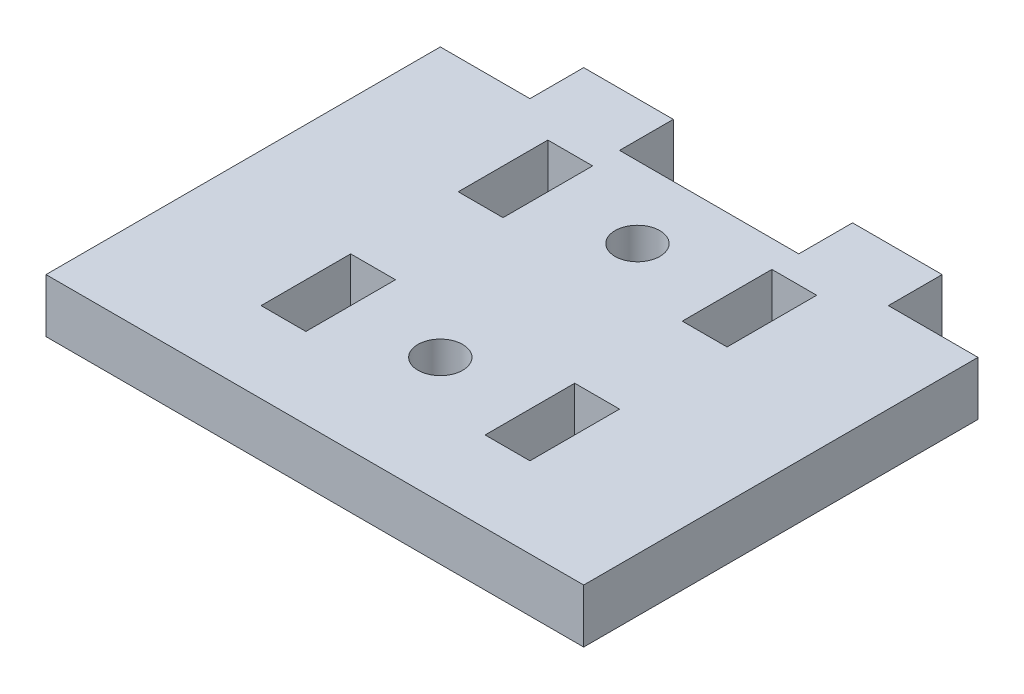
ISO-10303-21;
HEADER;
FILE_DESCRIPTION(('STEP AP214'),'2;1');
FILE_NAME('part.step','',(''),(''),'','','');
FILE_SCHEMA(('AUTOMOTIVE_DESIGN { 1 0 10303 214 1 1 1 1 }'));
ENDSEC;
DATA;
#1=APPLICATION_CONTEXT('core data for automotive mechanical design processes');
#2=APPLICATION_PROTOCOL_DEFINITION('international standard','automotive_design',2000,#1);
#3=PRODUCT_CONTEXT('',#1,'mechanical');
#4=PRODUCT('Part','Part','',(#3));
#5=PRODUCT_RELATED_PRODUCT_CATEGORY('part','',(#4));
#6=PRODUCT_DEFINITION_FORMATION('','',#4);
#7=PRODUCT_DEFINITION_CONTEXT('part definition',#1,'design');
#8=PRODUCT_DEFINITION('design','',#6,#7);
#9=PRODUCT_DEFINITION_SHAPE('','',#8);
#10=(LENGTH_UNIT() NAMED_UNIT(*) SI_UNIT(.MILLI.,.METRE.));
#11=(NAMED_UNIT(*) PLANE_ANGLE_UNIT() SI_UNIT($,.RADIAN.));
#12=(NAMED_UNIT(*) SI_UNIT($,.STERADIAN.) SOLID_ANGLE_UNIT());
#13=UNCERTAINTY_MEASURE_WITH_UNIT(LENGTH_MEASURE(1.E-05),#10,'distance_accuracy_value','');
#14=(GEOMETRIC_REPRESENTATION_CONTEXT(3) GLOBAL_UNCERTAINTY_ASSIGNED_CONTEXT((#13)) GLOBAL_UNIT_ASSIGNED_CONTEXT((#10,
#11,#12)) REPRESENTATION_CONTEXT('',''));
#15=CARTESIAN_POINT('',(0.,0.,0.));
#16=DIRECTION('',(0.,0.,1.));
#17=DIRECTION('',(1.,0.,0.));
#18=AXIS2_PLACEMENT_3D('',#15,#16,#17);
#19=CARTESIAN_POINT('',(0.,6.,0.));
#20=DIRECTION('',(0.,1.,0.));
#21=DIRECTION('',(0.,0.,1.));
#22=AXIS2_PLACEMENT_3D('',#19,#20,#21);
#23=PLANE('',#22);
#24=CARTESIAN_POINT('',(2.07620711782838,6.,-17.2849648352219));
#25=DIRECTION('',(0.,1.,0.));
#26=DIRECTION('',(0.,0.,1.));
#27=AXIS2_PLACEMENT_3D('',#24,#25,#26);
#28=CIRCLE('',#27,2.5);
#29=CARTESIAN_POINT('',(2.07620711782838,6.,-14.7849648352219));
#30=VERTEX_POINT('',#29);
#31=EDGE_CURVE('E260',#30,#30,#28,.T.);
#32=ORIENTED_EDGE('',*,*,#31,.F.);
#33=EDGE_LOOP('',(#32));
#34=FACE_BOUND('',#33,.T.);
#35=DIRECTION('',(0.,0.,1.));
#36=VECTOR('',#35,1.);
#37=CARTESIAN_POINT('',(-27.9237928821716,6.,-25.2849648352219));
#38=LINE('',#37,#36);
#39=CARTESIAN_POINT('',(-27.9237928821716,6.,-25.2849648352219));
#40=VERTEX_POINT('',#39);
#41=CARTESIAN_POINT('',(-27.9237928821716,6.,18.7150351647781));
#42=VERTEX_POINT('',#41);
#43=EDGE_CURVE('E405',#40,#42,#38,.T.);
#44=ORIENTED_EDGE('',*,*,#43,.T.);
#45=DIRECTION('',(1.,0.,0.));
#46=VECTOR('',#45,1.);
#47=CARTESIAN_POINT('',(-27.9237928821716,6.,18.7150351647781));
#48=LINE('',#47,#46);
#49=CARTESIAN_POINT('',(32.0762071178284,6.,18.7150351647781));
#50=VERTEX_POINT('',#49);
#51=EDGE_CURVE('E409',#42,#50,#48,.T.);
#52=ORIENTED_EDGE('',*,*,#51,.T.);
#53=DIRECTION('',(0.,0.,-1.));
#54=VECTOR('',#53,1.);
#55=CARTESIAN_POINT('',(32.0762071178284,6.,-25.2849648352219));
#56=LINE('',#55,#54);
#57=CARTESIAN_POINT('',(32.0762071178284,6.,-25.2849648352219));
#58=VERTEX_POINT('',#57);
#59=EDGE_CURVE('E413',#50,#58,#56,.T.);
#60=ORIENTED_EDGE('',*,*,#59,.T.);
#61=DIRECTION('',(-1.,0.,0.));
#62=VECTOR('',#61,1.);
#63=CARTESIAN_POINT('',(22.0762071178284,6.,-25.2849648352219));
#64=LINE('',#63,#62);
#65=CARTESIAN_POINT('',(22.0762071178284,6.,-25.2849648352219));
#66=VERTEX_POINT('',#65);
#67=EDGE_CURVE('E416',#58,#66,#64,.T.);
#68=ORIENTED_EDGE('',*,*,#67,.T.);
#69=DIRECTION('',(0.,0.,-1.));
#70=VECTOR('',#69,1.);
#71=CARTESIAN_POINT('',(22.0762071178284,6.,-25.2849648352219));
#72=LINE('',#71,#70);
#73=CARTESIAN_POINT('',(22.0762071178284,6.,-31.2849648352219));
#74=VERTEX_POINT('',#73);
#75=EDGE_CURVE('E419',#66,#74,#72,.T.);
#76=ORIENTED_EDGE('',*,*,#75,.T.);
#77=DIRECTION('',(-1.,0.,0.));
#78=VECTOR('',#77,1.);
#79=CARTESIAN_POINT('',(12.0762071178284,6.,-31.2849648352219));
#80=LINE('',#79,#78);
#81=CARTESIAN_POINT('',(12.0762071178284,6.,-31.2849648352219));
#82=VERTEX_POINT('',#81);
#83=EDGE_CURVE('E422',#74,#82,#80,.T.);
#84=ORIENTED_EDGE('',*,*,#83,.T.);
#85=DIRECTION('',(0.,0.,1.));
#86=VECTOR('',#85,1.);
#87=CARTESIAN_POINT('',(12.0762071178284,6.,-25.2849648352219));
#88=LINE('',#87,#86);
#89=CARTESIAN_POINT('',(12.0762071178284,6.,-25.2849648352219));
#90=VERTEX_POINT('',#89);
#91=EDGE_CURVE('E425',#82,#90,#88,.T.);
#92=ORIENTED_EDGE('',*,*,#91,.T.);
#93=DIRECTION('',(-1.,0.,0.));
#94=VECTOR('',#93,1.);
#95=CARTESIAN_POINT('',(-7.92379288217162,6.,-25.2849648352219));
#96=LINE('',#95,#94);
#97=CARTESIAN_POINT('',(-7.92379288217162,6.,-25.2849648352219));
#98=VERTEX_POINT('',#97);
#99=EDGE_CURVE('E428',#90,#98,#96,.T.);
#100=ORIENTED_EDGE('',*,*,#99,.T.);
#101=DIRECTION('',(0.,0.,-1.));
#102=VECTOR('',#101,1.);
#103=CARTESIAN_POINT('',(-7.92379288217162,6.,-25.2849648352219));
#104=LINE('',#103,#102);
#105=CARTESIAN_POINT('',(-7.92379288217161,6.,-31.2849648352219));
#106=VERTEX_POINT('',#105);
#107=EDGE_CURVE('E431',#98,#106,#104,.T.);
#108=ORIENTED_EDGE('',*,*,#107,.T.);
#109=DIRECTION('',(-1.,0.,0.));
#110=VECTOR('',#109,1.);
#111=CARTESIAN_POINT('',(-17.9237928821716,6.,-31.2849648352219));
#112=LINE('',#111,#110);
#113=CARTESIAN_POINT('',(-17.9237928821716,6.,-31.2849648352219));
#114=VERTEX_POINT('',#113);
#115=EDGE_CURVE('E434',#106,#114,#112,.T.);
#116=ORIENTED_EDGE('',*,*,#115,.T.);
#117=DIRECTION('',(0.,0.,1.));
#118=VECTOR('',#117,1.);
#119=CARTESIAN_POINT('',(-17.9237928821716,6.,-25.2849648352219));
#120=LINE('',#119,#118);
#121=CARTESIAN_POINT('',(-17.9237928821716,6.,-25.2849648352219));
#122=VERTEX_POINT('',#121);
#123=EDGE_CURVE('E437',#114,#122,#120,.T.);
#124=ORIENTED_EDGE('',*,*,#123,.T.);
#125=DIRECTION('',(-1.,0.,0.));
#126=VECTOR('',#125,1.);
#127=CARTESIAN_POINT('',(-27.9237928821716,6.,-25.2849648352219));
#128=LINE('',#127,#126);
#129=EDGE_CURVE('E440',#122,#40,#128,.T.);
#130=ORIENTED_EDGE('',*,*,#129,.T.);
#131=EDGE_LOOP('',(#44,#52,#60,#68,#76,#84,#92,#100,#108,#116,#124,#130));
#132=FACE_BOUND('',#131,.T.);
#133=DIRECTION('',(1.,0.,0.));
#134=VECTOR('',#133,1.);
#135=CARTESIAN_POINT('',(-12.9237928821716,6.,-12.2849648352219));
#136=LINE('',#135,#134);
#137=CARTESIAN_POINT('',(-12.9237928821716,6.,-12.2849648352219));
#138=VERTEX_POINT('',#137);
#139=CARTESIAN_POINT('',(-7.92379288217162,6.,-12.2849648352219));
#140=VERTEX_POINT('',#139);
#141=EDGE_CURVE('E365',#138,#140,#136,.T.);
#142=ORIENTED_EDGE('',*,*,#141,.F.);
#143=DIRECTION('',(0.,0.,1.));
#144=VECTOR('',#143,1.);
#145=CARTESIAN_POINT('',(-12.9237928821716,6.,-22.2849648352219));
#146=LINE('',#145,#144);
#147=CARTESIAN_POINT('',(-12.9237928821716,6.,-22.2849648352219));
#148=VERTEX_POINT('',#147);
#149=EDGE_CURVE('E362',#148,#138,#146,.T.);
#150=ORIENTED_EDGE('',*,*,#149,.F.);
#151=DIRECTION('',(-1.,0.,0.));
#152=VECTOR('',#151,1.);
#153=CARTESIAN_POINT('',(-12.9237928821716,6.,-22.2849648352219));
#154=LINE('',#153,#152);
#155=CARTESIAN_POINT('',(-7.92379288217162,6.,-22.2849648352219));
#156=VERTEX_POINT('',#155);
#157=EDGE_CURVE('E373',#156,#148,#154,.T.);
#158=ORIENTED_EDGE('',*,*,#157,.F.);
#159=DIRECTION('',(0.,0.,-1.));
#160=VECTOR('',#159,1.);
#161=CARTESIAN_POINT('',(-7.92379288217162,6.,-22.2849648352219));
#162=LINE('',#161,#160);
#163=EDGE_CURVE('E369',#140,#156,#162,.T.);
#164=ORIENTED_EDGE('',*,*,#163,.F.);
#165=EDGE_LOOP('',(#142,#150,#158,#164));
#166=FACE_BOUND('',#165,.T.);
#167=DIRECTION('',(1.,0.,0.));
#168=VECTOR('',#167,1.);
#169=CARTESIAN_POINT('',(-12.9237928821716,6.,9.71503516477805));
#170=LINE('',#169,#168);
#171=CARTESIAN_POINT('',(-12.9237928821716,6.,9.71503516477805));
#172=VERTEX_POINT('',#171);
#173=CARTESIAN_POINT('',(-7.92379288217161,6.,9.71503516477805));
#174=VERTEX_POINT('',#173);
#175=EDGE_CURVE('E322',#172,#174,#170,.T.);
#176=ORIENTED_EDGE('',*,*,#175,.F.);
#177=DIRECTION('',(0.,0.,1.));
#178=VECTOR('',#177,1.);
#179=CARTESIAN_POINT('',(-12.9237928821716,6.,-0.284964835221946));
#180=LINE('',#179,#178);
#181=CARTESIAN_POINT('',(-12.9237928821716,6.,-0.284964835221946));
#182=VERTEX_POINT('',#181);
#183=EDGE_CURVE('E319',#182,#172,#180,.T.);
#184=ORIENTED_EDGE('',*,*,#183,.F.);
#185=DIRECTION('',(-1.,0.,0.));
#186=VECTOR('',#185,1.);
#187=CARTESIAN_POINT('',(-12.9237928821716,6.,-0.284964835221946));
#188=LINE('',#187,#186);
#189=CARTESIAN_POINT('',(-7.92379288217161,6.,-0.284964835221946));
#190=VERTEX_POINT('',#189);
#191=EDGE_CURVE('E330',#190,#182,#188,.T.);
#192=ORIENTED_EDGE('',*,*,#191,.F.);
#193=DIRECTION('',(0.,0.,-1.));
#194=VECTOR('',#193,1.);
#195=CARTESIAN_POINT('',(-7.92379288217161,6.,-0.284964835221946));
#196=LINE('',#195,#194);
#197=EDGE_CURVE('E326',#174,#190,#196,.T.);
#198=ORIENTED_EDGE('',*,*,#197,.F.);
#199=EDGE_LOOP('',(#176,#184,#192,#198));
#200=FACE_BOUND('',#199,.T.);
#201=DIRECTION('',(1.,0.,0.));
#202=VECTOR('',#201,1.);
#203=CARTESIAN_POINT('',(12.0762071178284,6.,-12.2849648352219));
#204=LINE('',#203,#202);
#205=CARTESIAN_POINT('',(12.0762071178284,6.,-12.2849648352219));
#206=VERTEX_POINT('',#205);
#207=CARTESIAN_POINT('',(17.0762071178284,6.,-12.2849648352219));
#208=VERTEX_POINT('',#207);
#209=EDGE_CURVE('E279',#206,#208,#204,.T.);
#210=ORIENTED_EDGE('',*,*,#209,.F.);
#211=DIRECTION('',(0.,0.,1.));
#212=VECTOR('',#211,1.);
#213=CARTESIAN_POINT('',(12.0762071178284,6.,-22.2849648352219));
#214=LINE('',#213,#212);
#215=CARTESIAN_POINT('',(12.0762071178284,6.,-22.2849648352219));
#216=VERTEX_POINT('',#215);
#217=EDGE_CURVE('E276',#216,#206,#214,.T.);
#218=ORIENTED_EDGE('',*,*,#217,.F.);
#219=DIRECTION('',(-1.,0.,0.));
#220=VECTOR('',#219,1.);
#221=CARTESIAN_POINT('',(12.0762071178284,6.,-22.2849648352219));
#222=LINE('',#221,#220);
#223=CARTESIAN_POINT('',(17.0762071178284,6.,-22.2849648352219));
#224=VERTEX_POINT('',#223);
#225=EDGE_CURVE('E287',#224,#216,#222,.T.);
#226=ORIENTED_EDGE('',*,*,#225,.F.);
#227=DIRECTION('',(0.,0.,-1.));
#228=VECTOR('',#227,1.);
#229=CARTESIAN_POINT('',(17.0762071178284,6.,-22.2849648352219));
#230=LINE('',#229,#228);
#231=EDGE_CURVE('E283',#208,#224,#230,.T.);
#232=ORIENTED_EDGE('',*,*,#231,.F.);
#233=EDGE_LOOP('',(#210,#218,#226,#232));
#234=FACE_BOUND('',#233,.T.);
#235=DIRECTION('',(1.,0.,0.));
#236=VECTOR('',#235,1.);
#237=CARTESIAN_POINT('',(12.0762071178284,6.,9.71503516477805));
#238=LINE('',#237,#236);
#239=CARTESIAN_POINT('',(12.0762071178284,6.,9.71503516477805));
#240=VERTEX_POINT('',#239);
#241=CARTESIAN_POINT('',(17.0762071178284,6.,9.71503516477805));
#242=VERTEX_POINT('',#241);
#243=EDGE_CURVE('E234',#240,#242,#238,.T.);
#244=ORIENTED_EDGE('',*,*,#243,.F.);
#245=DIRECTION('',(0.,0.,1.));
#246=VECTOR('',#245,1.);
#247=CARTESIAN_POINT('',(12.0762071178284,6.,-0.284964835221946));
#248=LINE('',#247,#246);
#249=CARTESIAN_POINT('',(12.0762071178284,6.,-0.284964835221946));
#250=VERTEX_POINT('',#249);
#251=EDGE_CURVE('E225',#250,#240,#248,.T.);
#252=ORIENTED_EDGE('',*,*,#251,.F.);
#253=DIRECTION('',(-1.,0.,0.));
#254=VECTOR('',#253,1.);
#255=CARTESIAN_POINT('',(12.0762071178284,6.,-0.284964835221946));
#256=LINE('',#255,#254);
#257=CARTESIAN_POINT('',(17.0762071178284,6.,-0.284964835221946));
#258=VERTEX_POINT('',#257);
#259=EDGE_CURVE('E252',#258,#250,#256,.T.);
#260=ORIENTED_EDGE('',*,*,#259,.F.);
#261=DIRECTION('',(0.,0.,-1.));
#262=VECTOR('',#261,1.);
#263=CARTESIAN_POINT('',(17.0762071178284,6.,-0.284964835221946));
#264=LINE('',#263,#262);
#265=EDGE_CURVE('E248',#242,#258,#264,.T.);
#266=ORIENTED_EDGE('',*,*,#265,.F.);
#267=EDGE_LOOP('',(#244,#252,#260,#266));
#268=FACE_BOUND('',#267,.T.);
#269=CARTESIAN_POINT('',(2.07620711782839,6.,4.71503516477806));
#270=DIRECTION('',(0.,1.,0.));
#271=DIRECTION('',(0.,0.,1.));
#272=AXIS2_PLACEMENT_3D('',#269,#270,#271);
#273=CIRCLE('',#272,2.5);
#274=CARTESIAN_POINT('',(2.07620711782839,6.,7.21503516477806));
#275=VERTEX_POINT('',#274);
#276=EDGE_CURVE('E872',#275,#275,#273,.T.);
#277=ORIENTED_EDGE('',*,*,#276,.F.);
#278=EDGE_LOOP('',(#277));
#279=FACE_BOUND('',#278,.T.);
#280=ADVANCED_FACE('F39',(#34,#132,#166,#200,#234,#268,#279),#23,.T.);
#281=CARTESIAN_POINT('',(0.,0.,0.));
#282=DIRECTION('',(0.,1.,0.));
#283=DIRECTION('',(0.,0.,1.));
#284=AXIS2_PLACEMENT_3D('',#281,#282,#283);
#285=PLANE('',#284);
#286=DIRECTION('',(0.,0.,1.));
#287=VECTOR('',#286,1.);
#288=CARTESIAN_POINT('',(12.0762071178284,0.,-22.2849648352219));
#289=LINE('',#288,#287);
#290=CARTESIAN_POINT('',(12.0762071178284,0.,-22.2849648352219));
#291=VERTEX_POINT('',#290);
#292=CARTESIAN_POINT('',(12.0762071178284,0.,-12.2849648352219));
#293=VERTEX_POINT('',#292);
#294=EDGE_CURVE('E243',#291,#293,#289,.T.);
#295=ORIENTED_EDGE('',*,*,#294,.T.);
#296=DIRECTION('',(1.,0.,0.));
#297=VECTOR('',#296,1.);
#298=CARTESIAN_POINT('',(12.0762071178284,0.,-12.2849648352219));
#299=LINE('',#298,#297);
#300=CARTESIAN_POINT('',(17.0762071178284,0.,-12.2849648352219));
#301=VERTEX_POINT('',#300);
#302=EDGE_CURVE('E294',#293,#301,#299,.T.);
#303=ORIENTED_EDGE('',*,*,#302,.T.);
#304=DIRECTION('',(0.,0.,-1.));
#305=VECTOR('',#304,1.);
#306=CARTESIAN_POINT('',(17.0762071178284,0.,-22.2849648352219));
#307=LINE('',#306,#305);
#308=CARTESIAN_POINT('',(17.0762071178284,0.,-22.2849648352219));
#309=VERTEX_POINT('',#308);
#310=EDGE_CURVE('E298',#301,#309,#307,.T.);
#311=ORIENTED_EDGE('',*,*,#310,.T.);
#312=DIRECTION('',(-1.,0.,0.));
#313=VECTOR('',#312,1.);
#314=CARTESIAN_POINT('',(12.0762071178284,0.,-22.2849648352219));
#315=LINE('',#314,#313);
#316=EDGE_CURVE('E280',#309,#291,#315,.T.);
#317=ORIENTED_EDGE('',*,*,#316,.T.);
#318=EDGE_LOOP('',(#295,#303,#311,#317));
#319=FACE_BOUND('',#318,.T.);
#320=DIRECTION('',(0.,0.,1.));
#321=VECTOR('',#320,1.);
#322=CARTESIAN_POINT('',(-12.9237928821716,0.,-22.2849648352219));
#323=LINE('',#322,#321);
#324=CARTESIAN_POINT('',(-12.9237928821716,0.,-22.2849648352219));
#325=VERTEX_POINT('',#324);
#326=CARTESIAN_POINT('',(-12.9237928821716,0.,-12.2849648352219));
#327=VERTEX_POINT('',#326);
#328=EDGE_CURVE('E361',#325,#327,#323,.T.);
#329=ORIENTED_EDGE('',*,*,#328,.T.);
#330=DIRECTION('',(1.,0.,0.));
#331=VECTOR('',#330,1.);
#332=CARTESIAN_POINT('',(-12.9237928821716,0.,-12.2849648352219));
#333=LINE('',#332,#331);
#334=CARTESIAN_POINT('',(-7.92379288217162,0.,-12.2849648352219));
#335=VERTEX_POINT('',#334);
#336=EDGE_CURVE('E380',#327,#335,#333,.T.);
#337=ORIENTED_EDGE('',*,*,#336,.T.);
#338=DIRECTION('',(0.,0.,-1.));
#339=VECTOR('',#338,1.);
#340=CARTESIAN_POINT('',(-7.92379288217162,0.,-22.2849648352219));
#341=LINE('',#340,#339);
#342=CARTESIAN_POINT('',(-7.92379288217162,0.,-22.2849648352219));
#343=VERTEX_POINT('',#342);
#344=EDGE_CURVE('E384',#335,#343,#341,.T.);
#345=ORIENTED_EDGE('',*,*,#344,.T.);
#346=DIRECTION('',(-1.,0.,0.));
#347=VECTOR('',#346,1.);
#348=CARTESIAN_POINT('',(-12.9237928821716,0.,-22.2849648352219));
#349=LINE('',#348,#347);
#350=EDGE_CURVE('E366',#343,#325,#349,.T.);
#351=ORIENTED_EDGE('',*,*,#350,.T.);
#352=EDGE_LOOP('',(#329,#337,#345,#351));
#353=FACE_BOUND('',#352,.T.);
#354=DIRECTION('',(0.,0.,1.));
#355=VECTOR('',#354,1.);
#356=CARTESIAN_POINT('',(-27.9237928821716,0.,-25.2849648352219));
#357=LINE('',#356,#355);
#358=CARTESIAN_POINT('',(-27.9237928821716,0.,-25.2849648352219));
#359=VERTEX_POINT('',#358);
#360=CARTESIAN_POINT('',(-27.9237928821716,0.,18.7150351647781));
#361=VERTEX_POINT('',#360);
#362=EDGE_CURVE('E404',#359,#361,#357,.T.);
#363=ORIENTED_EDGE('',*,*,#362,.F.);
#364=DIRECTION('',(-1.,0.,0.));
#365=VECTOR('',#364,1.);
#366=CARTESIAN_POINT('',(-27.9237928821716,0.,-25.2849648352219));
#367=LINE('',#366,#365);
#368=CARTESIAN_POINT('',(-17.9237928821716,0.,-25.2849648352219));
#369=VERTEX_POINT('',#368);
#370=EDGE_CURVE('E410',#369,#359,#367,.T.);
#371=ORIENTED_EDGE('',*,*,#370,.F.);
#372=DIRECTION('',(0.,0.,1.));
#373=VECTOR('',#372,1.);
#374=CARTESIAN_POINT('',(-17.9237928821716,0.,-25.2849648352219));
#375=LINE('',#374,#373);
#376=CARTESIAN_POINT('',(-17.9237928821716,0.,-31.2849648352219));
#377=VERTEX_POINT('',#376);
#378=EDGE_CURVE('E474',#377,#369,#375,.T.);
#379=ORIENTED_EDGE('',*,*,#378,.F.);
#380=DIRECTION('',(-1.,0.,0.));
#381=VECTOR('',#380,1.);
#382=CARTESIAN_POINT('',(-17.9237928821716,0.,-31.2849648352219));
#383=LINE('',#382,#381);
#384=CARTESIAN_POINT('',(-7.92379288217161,0.,-31.2849648352219));
#385=VERTEX_POINT('',#384);
#386=EDGE_CURVE('E471',#385,#377,#383,.T.);
#387=ORIENTED_EDGE('',*,*,#386,.F.);
#388=DIRECTION('',(0.,0.,-1.));
#389=VECTOR('',#388,1.);
#390=CARTESIAN_POINT('',(-7.92379288217162,0.,-25.2849648352219));
#391=LINE('',#390,#389);
#392=CARTESIAN_POINT('',(-7.92379288217162,0.,-25.2849648352219));
#393=VERTEX_POINT('',#392);
#394=EDGE_CURVE('E468',#393,#385,#391,.T.);
#395=ORIENTED_EDGE('',*,*,#394,.F.);
#396=DIRECTION('',(-1.,0.,0.));
#397=VECTOR('',#396,1.);
#398=CARTESIAN_POINT('',(-7.92379288217162,0.,-25.2849648352219));
#399=LINE('',#398,#397);
#400=CARTESIAN_POINT('',(12.0762071178284,0.,-25.2849648352219));
#401=VERTEX_POINT('',#400);
#402=EDGE_CURVE('E465',#401,#393,#399,.T.);
#403=ORIENTED_EDGE('',*,*,#402,.F.);
#404=DIRECTION('',(0.,0.,1.));
#405=VECTOR('',#404,1.);
#406=CARTESIAN_POINT('',(12.0762071178284,0.,-25.2849648352219));
#407=LINE('',#406,#405);
#408=CARTESIAN_POINT('',(12.0762071178284,0.,-31.2849648352219));
#409=VERTEX_POINT('',#408);
#410=EDGE_CURVE('E462',#409,#401,#407,.T.);
#411=ORIENTED_EDGE('',*,*,#410,.F.);
#412=DIRECTION('',(-1.,0.,0.));
#413=VECTOR('',#412,1.);
#414=CARTESIAN_POINT('',(12.0762071178284,0.,-31.2849648352219));
#415=LINE('',#414,#413);
#416=CARTESIAN_POINT('',(22.0762071178284,0.,-31.2849648352219));
#417=VERTEX_POINT('',#416);
#418=EDGE_CURVE('E459',#417,#409,#415,.T.);
#419=ORIENTED_EDGE('',*,*,#418,.F.);
#420=DIRECTION('',(0.,0.,-1.));
#421=VECTOR('',#420,1.);
#422=CARTESIAN_POINT('',(22.0762071178284,0.,-25.2849648352219));
#423=LINE('',#422,#421);
#424=CARTESIAN_POINT('',(22.0762071178284,0.,-25.2849648352219));
#425=VERTEX_POINT('',#424);
#426=EDGE_CURVE('E456',#425,#417,#423,.T.);
#427=ORIENTED_EDGE('',*,*,#426,.F.);
#428=DIRECTION('',(-1.,0.,0.));
#429=VECTOR('',#428,1.);
#430=CARTESIAN_POINT('',(22.0762071178284,0.,-25.2849648352219));
#431=LINE('',#430,#429);
#432=CARTESIAN_POINT('',(32.0762071178284,0.,-25.2849648352219));
#433=VERTEX_POINT('',#432);
#434=EDGE_CURVE('E453',#433,#425,#431,.T.);
#435=ORIENTED_EDGE('',*,*,#434,.F.);
#436=DIRECTION('',(0.,0.,-1.));
#437=VECTOR('',#436,1.);
#438=CARTESIAN_POINT('',(32.0762071178284,0.,-25.2849648352219));
#439=LINE('',#438,#437);
#440=CARTESIAN_POINT('',(32.0762071178284,0.,18.7150351647781));
#441=VERTEX_POINT('',#440);
#442=EDGE_CURVE('E450',#441,#433,#439,.T.);
#443=ORIENTED_EDGE('',*,*,#442,.F.);
#444=DIRECTION('',(1.,0.,0.));
#445=VECTOR('',#444,1.);
#446=CARTESIAN_POINT('',(-27.9237928821716,0.,18.7150351647781));
#447=LINE('',#446,#445);
#448=EDGE_CURVE('E447',#361,#441,#447,.T.);
#449=ORIENTED_EDGE('',*,*,#448,.F.);
#450=EDGE_LOOP('',(#363,#371,#379,#387,#395,#403,#411,#419,#427,#435,#443,#449));
#451=FACE_BOUND('',#450,.T.);
#452=DIRECTION('',(0.,0.,1.));
#453=VECTOR('',#452,1.);
#454=CARTESIAN_POINT('',(-12.9237928821716,0.,-0.284964835221946));
#455=LINE('',#454,#453);
#456=CARTESIAN_POINT('',(-12.9237928821716,0.,-0.284964835221946));
#457=VERTEX_POINT('',#456);
#458=CARTESIAN_POINT('',(-12.9237928821716,0.,9.71503516477805));
#459=VERTEX_POINT('',#458);
#460=EDGE_CURVE('E318',#457,#459,#455,.T.);
#461=ORIENTED_EDGE('',*,*,#460,.T.);
#462=DIRECTION('',(1.,0.,0.));
#463=VECTOR('',#462,1.);
#464=CARTESIAN_POINT('',(-12.9237928821716,0.,9.71503516477805));
#465=LINE('',#464,#463);
#466=CARTESIAN_POINT('',(-7.92379288217161,0.,9.71503516477805));
#467=VERTEX_POINT('',#466);
#468=EDGE_CURVE('E337',#459,#467,#465,.T.);
#469=ORIENTED_EDGE('',*,*,#468,.T.);
#470=DIRECTION('',(0.,0.,-1.));
#471=VECTOR('',#470,1.);
#472=CARTESIAN_POINT('',(-7.92379288217161,0.,-0.284964835221946));
#473=LINE('',#472,#471);
#474=CARTESIAN_POINT('',(-7.92379288217161,0.,-0.284964835221946));
#475=VERTEX_POINT('',#474);
#476=EDGE_CURVE('E341',#467,#475,#473,.T.);
#477=ORIENTED_EDGE('',*,*,#476,.T.);
#478=DIRECTION('',(-1.,0.,0.));
#479=VECTOR('',#478,1.);
#480=CARTESIAN_POINT('',(-12.9237928821716,0.,-0.284964835221946));
#481=LINE('',#480,#479);
#482=EDGE_CURVE('E323',#475,#457,#481,.T.);
#483=ORIENTED_EDGE('',*,*,#482,.T.);
#484=EDGE_LOOP('',(#461,#469,#477,#483));
#485=FACE_BOUND('',#484,.T.);
#486=DIRECTION('',(0.,0.,1.));
#487=VECTOR('',#486,1.);
#488=CARTESIAN_POINT('',(12.0762071178284,0.,-0.284964835221946));
#489=LINE('',#488,#487);
#490=CARTESIAN_POINT('',(12.0762071178284,0.,-0.284964835221946));
#491=VERTEX_POINT('',#490);
#492=CARTESIAN_POINT('',(12.0762071178284,0.,9.71503516477805));
#493=VERTEX_POINT('',#492);
#494=EDGE_CURVE('E63',#491,#493,#489,.T.);
#495=ORIENTED_EDGE('',*,*,#494,.T.);
#496=DIRECTION('',(1.,0.,0.));
#497=VECTOR('',#496,1.);
#498=CARTESIAN_POINT('',(12.0762071178284,0.,9.71503516477805));
#499=LINE('',#498,#497);
#500=CARTESIAN_POINT('',(17.0762071178284,0.,9.71503516477805));
#501=VERTEX_POINT('',#500);
#502=EDGE_CURVE('E241',#493,#501,#499,.T.);
#503=ORIENTED_EDGE('',*,*,#502,.T.);
#504=DIRECTION('',(0.,0.,-1.));
#505=VECTOR('',#504,1.);
#506=CARTESIAN_POINT('',(17.0762071178284,0.,-0.284964835221946));
#507=LINE('',#506,#505);
#508=CARTESIAN_POINT('',(17.0762071178284,0.,-0.284964835221946));
#509=VERTEX_POINT('',#508);
#510=EDGE_CURVE('E263',#501,#509,#507,.T.);
#511=ORIENTED_EDGE('',*,*,#510,.T.);
#512=DIRECTION('',(-1.,0.,0.));
#513=VECTOR('',#512,1.);
#514=CARTESIAN_POINT('',(12.0762071178284,0.,-0.284964835221946));
#515=LINE('',#514,#513);
#516=EDGE_CURVE('E235',#509,#491,#515,.T.);
#517=ORIENTED_EDGE('',*,*,#516,.T.);
#518=EDGE_LOOP('',(#495,#503,#511,#517));
#519=FACE_BOUND('',#518,.T.);
#520=CARTESIAN_POINT('',(2.07620711782838,0.,-17.2849648352219));
#521=DIRECTION('',(0.,1.,0.));
#522=DIRECTION('',(0.,0.,1.));
#523=AXIS2_PLACEMENT_3D('',#520,#521,#522);
#524=CIRCLE('',#523,2.5);
#525=CARTESIAN_POINT('',(2.07620711782838,0.,-14.7849648352219));
#526=VERTEX_POINT('',#525);
#527=EDGE_CURVE('E880',#526,#526,#524,.T.);
#528=ORIENTED_EDGE('',*,*,#527,.T.);
#529=EDGE_LOOP('',(#528));
#530=FACE_BOUND('',#529,.T.);
#531=CARTESIAN_POINT('',(2.07620711782839,0.,4.71503516477806));
#532=DIRECTION('',(0.,1.,0.));
#533=DIRECTION('',(0.,0.,1.));
#534=AXIS2_PLACEMENT_3D('',#531,#532,#533);
#535=CIRCLE('',#534,2.5);
#536=CARTESIAN_POINT('',(2.07620711782839,0.,7.21503516477806));
#537=VERTEX_POINT('',#536);
#538=EDGE_CURVE('E875',#537,#537,#535,.T.);
#539=ORIENTED_EDGE('',*,*,#538,.T.);
#540=EDGE_LOOP('',(#539));
#541=FACE_BOUND('',#540,.T.);
#542=ADVANCED_FACE('F529',(#319,#353,#451,#485,#519,#530,#541),#285,.F.);
#543=CARTESIAN_POINT('',(-27.9237928821716,6.,-25.2849648352219));
#544=DIRECTION('',(1.,0.,0.));
#545=DIRECTION('',(0.,0.,-1.));
#546=AXIS2_PLACEMENT_3D('',#543,#544,#545);
#547=PLANE('',#546);
#548=ORIENTED_EDGE('',*,*,#362,.T.);
#549=DIRECTION('',(0.,-1.,0.));
#550=VECTOR('',#549,1.);
#551=CARTESIAN_POINT('',(-27.9237928821716,6.,18.7150351647781));
#552=LINE('',#551,#550);
#553=EDGE_CURVE('E11',#42,#361,#552,.T.);
#554=ORIENTED_EDGE('',*,*,#553,.F.);
#555=ORIENTED_EDGE('',*,*,#43,.F.);
#556=DIRECTION('',(0.,-1.,0.));
#557=VECTOR('',#556,1.);
#558=CARTESIAN_POINT('',(-27.9237928821716,6.,-25.2849648352219));
#559=LINE('',#558,#557);
#560=EDGE_CURVE('E443',#40,#359,#559,.T.);
#561=ORIENTED_EDGE('',*,*,#560,.T.);
#562=EDGE_LOOP('',(#548,#554,#555,#561));
#563=FACE_BOUND('',#562,.T.);
#564=ADVANCED_FACE('F41',(#563),#547,.F.);
#565=CARTESIAN_POINT('',(-27.9237928821716,6.,18.7150351647781));
#566=DIRECTION('',(0.,0.,-1.));
#567=DIRECTION('',(-1.,0.,0.));
#568=AXIS2_PLACEMENT_3D('',#565,#566,#567);
#569=PLANE('',#568);
#570=ORIENTED_EDGE('',*,*,#448,.T.);
#571=DIRECTION('',(0.,-1.,0.));
#572=VECTOR('',#571,1.);
#573=CARTESIAN_POINT('',(32.0762071178284,6.,18.7150351647781));
#574=LINE('',#573,#572);
#575=EDGE_CURVE('E48',#50,#441,#574,.T.);
#576=ORIENTED_EDGE('',*,*,#575,.F.);
#577=ORIENTED_EDGE('',*,*,#51,.F.);
#578=ORIENTED_EDGE('',*,*,#553,.T.);
#579=EDGE_LOOP('',(#570,#576,#577,#578));
#580=FACE_BOUND('',#579,.T.);
#581=ADVANCED_FACE('F547',(#580),#569,.F.);
#582=CARTESIAN_POINT('',(32.0762071178284,6.,-25.2849648352219));
#583=DIRECTION('',(-1.,0.,0.));
#584=DIRECTION('',(0.,0.,1.));
#585=AXIS2_PLACEMENT_3D('',#582,#583,#584);
#586=PLANE('',#585);
#587=ORIENTED_EDGE('',*,*,#442,.T.);
#588=DIRECTION('',(0.,-1.,0.));
#589=VECTOR('',#588,1.);
#590=CARTESIAN_POINT('',(32.0762071178284,6.,-25.2849648352219));
#591=LINE('',#590,#589);
#592=EDGE_CURVE('E514',#58,#433,#591,.T.);
#593=ORIENTED_EDGE('',*,*,#592,.F.);
#594=ORIENTED_EDGE('',*,*,#59,.F.);
#595=ORIENTED_EDGE('',*,*,#575,.T.);
#596=EDGE_LOOP('',(#587,#593,#594,#595));
#597=FACE_BOUND('',#596,.T.);
#598=ADVANCED_FACE('F523',(#597),#586,.F.);
#599=CARTESIAN_POINT('',(22.0762071178284,6.,-25.2849648352219));
#600=DIRECTION('',(0.,0.,1.));
#601=DIRECTION('',(1.,0.,0.));
#602=AXIS2_PLACEMENT_3D('',#599,#600,#601);
#603=PLANE('',#602);
#604=ORIENTED_EDGE('',*,*,#434,.T.);
#605=DIRECTION('',(0.,-1.,0.));
#606=VECTOR('',#605,1.);
#607=CARTESIAN_POINT('',(22.0762071178284,6.,-25.2849648352219));
#608=LINE('',#607,#606);
#609=EDGE_CURVE('E510',#66,#425,#608,.T.);
#610=ORIENTED_EDGE('',*,*,#609,.F.);
#611=ORIENTED_EDGE('',*,*,#67,.F.);
#612=ORIENTED_EDGE('',*,*,#592,.T.);
#613=EDGE_LOOP('',(#604,#610,#611,#612));
#614=FACE_BOUND('',#613,.T.);
#615=ADVANCED_FACE('F535',(#614),#603,.F.);
#616=CARTESIAN_POINT('',(22.0762071178284,6.,-25.2849648352219));
#617=DIRECTION('',(-1.,0.,0.));
#618=DIRECTION('',(0.,0.,1.));
#619=AXIS2_PLACEMENT_3D('',#616,#617,#618);
#620=PLANE('',#619);
#621=ORIENTED_EDGE('',*,*,#426,.T.);
#622=DIRECTION('',(0.,-1.,0.));
#623=VECTOR('',#622,1.);
#624=CARTESIAN_POINT('',(22.0762071178284,6.,-31.2849648352219));
#625=LINE('',#624,#623);
#626=EDGE_CURVE('E506',#74,#417,#625,.T.);
#627=ORIENTED_EDGE('',*,*,#626,.F.);
#628=ORIENTED_EDGE('',*,*,#75,.F.);
#629=ORIENTED_EDGE('',*,*,#609,.T.);
#630=EDGE_LOOP('',(#621,#627,#628,#629));
#631=FACE_BOUND('',#630,.T.);
#632=ADVANCED_FACE('F539',(#631),#620,.F.);
#633=CARTESIAN_POINT('',(12.0762071178284,6.,-31.2849648352219));
#634=DIRECTION('',(0.,0.,1.));
#635=DIRECTION('',(1.,0.,0.));
#636=AXIS2_PLACEMENT_3D('',#633,#634,#635);
#637=PLANE('',#636);
#638=ORIENTED_EDGE('',*,*,#418,.T.);
#639=DIRECTION('',(0.,-1.,0.));
#640=VECTOR('',#639,1.);
#641=CARTESIAN_POINT('',(12.0762071178284,6.,-31.2849648352219));
#642=LINE('',#641,#640);
#643=EDGE_CURVE('E502',#82,#409,#642,.T.);
#644=ORIENTED_EDGE('',*,*,#643,.F.);
#645=ORIENTED_EDGE('',*,*,#83,.F.);
#646=ORIENTED_EDGE('',*,*,#626,.T.);
#647=EDGE_LOOP('',(#638,#644,#645,#646));
#648=FACE_BOUND('',#647,.T.);
#649=ADVANCED_FACE('F580',(#648),#637,.F.);
#650=CARTESIAN_POINT('',(12.0762071178284,6.,-25.2849648352219));
#651=DIRECTION('',(1.,0.,0.));
#652=DIRECTION('',(0.,0.,-1.));
#653=AXIS2_PLACEMENT_3D('',#650,#651,#652);
#654=PLANE('',#653);
#655=ORIENTED_EDGE('',*,*,#410,.T.);
#656=DIRECTION('',(0.,-1.,0.));
#657=VECTOR('',#656,1.);
#658=CARTESIAN_POINT('',(12.0762071178284,6.,-25.2849648352219));
#659=LINE('',#658,#657);
#660=EDGE_CURVE('E498',#90,#401,#659,.T.);
#661=ORIENTED_EDGE('',*,*,#660,.F.);
#662=ORIENTED_EDGE('',*,*,#91,.F.);
#663=ORIENTED_EDGE('',*,*,#643,.T.);
#664=EDGE_LOOP('',(#655,#661,#662,#663));
#665=FACE_BOUND('',#664,.T.);
#666=ADVANCED_FACE('F578',(#665),#654,.F.);
#667=CARTESIAN_POINT('',(-7.92379288217162,6.,-25.2849648352219));
#668=DIRECTION('',(0.,0.,1.));
#669=DIRECTION('',(1.,0.,0.));
#670=AXIS2_PLACEMENT_3D('',#667,#668,#669);
#671=PLANE('',#670);
#672=ORIENTED_EDGE('',*,*,#402,.T.);
#673=DIRECTION('',(0.,-1.,0.));
#674=VECTOR('',#673,1.);
#675=CARTESIAN_POINT('',(-7.92379288217162,6.,-25.2849648352219));
#676=LINE('',#675,#674);
#677=EDGE_CURVE('E494',#98,#393,#676,.T.);
#678=ORIENTED_EDGE('',*,*,#677,.F.);
#679=ORIENTED_EDGE('',*,*,#99,.F.);
#680=ORIENTED_EDGE('',*,*,#660,.T.);
#681=EDGE_LOOP('',(#672,#678,#679,#680));
#682=FACE_BOUND('',#681,.T.);
#683=ADVANCED_FACE('F574',(#682),#671,.F.);
#684=CARTESIAN_POINT('',(-7.92379288217162,6.,-25.2849648352219));
#685=DIRECTION('',(-1.,0.,0.));
#686=DIRECTION('',(0.,0.,1.));
#687=AXIS2_PLACEMENT_3D('',#684,#685,#686);
#688=PLANE('',#687);
#689=ORIENTED_EDGE('',*,*,#394,.T.);
#690=DIRECTION('',(0.,-1.,0.));
#691=VECTOR('',#690,1.);
#692=CARTESIAN_POINT('',(-7.92379288217161,6.,-31.2849648352219));
#693=LINE('',#692,#691);
#694=EDGE_CURVE('E490',#106,#385,#693,.T.);
#695=ORIENTED_EDGE('',*,*,#694,.F.);
#696=ORIENTED_EDGE('',*,*,#107,.F.);
#697=ORIENTED_EDGE('',*,*,#677,.T.);
#698=EDGE_LOOP('',(#689,#695,#696,#697));
#699=FACE_BOUND('',#698,.T.);
#700=ADVANCED_FACE('F569',(#699),#688,.F.);
#701=CARTESIAN_POINT('',(-17.9237928821716,6.,-31.2849648352219));
#702=DIRECTION('',(0.,0.,1.));
#703=DIRECTION('',(1.,0.,0.));
#704=AXIS2_PLACEMENT_3D('',#701,#702,#703);
#705=PLANE('',#704);
#706=ORIENTED_EDGE('',*,*,#386,.T.);
#707=DIRECTION('',(0.,-1.,0.));
#708=VECTOR('',#707,1.);
#709=CARTESIAN_POINT('',(-17.9237928821716,6.,-31.2849648352219));
#710=LINE('',#709,#708);
#711=EDGE_CURVE('E486',#114,#377,#710,.T.);
#712=ORIENTED_EDGE('',*,*,#711,.F.);
#713=ORIENTED_EDGE('',*,*,#115,.F.);
#714=ORIENTED_EDGE('',*,*,#694,.T.);
#715=EDGE_LOOP('',(#706,#712,#713,#714));
#716=FACE_BOUND('',#715,.T.);
#717=ADVANCED_FACE('F563',(#716),#705,.F.);
#718=CARTESIAN_POINT('',(-17.9237928821716,6.,-25.2849648352219));
#719=DIRECTION('',(1.,0.,0.));
#720=DIRECTION('',(0.,0.,-1.));
#721=AXIS2_PLACEMENT_3D('',#718,#719,#720);
#722=PLANE('',#721);
#723=ORIENTED_EDGE('',*,*,#378,.T.);
#724=DIRECTION('',(0.,-1.,0.));
#725=VECTOR('',#724,1.);
#726=CARTESIAN_POINT('',(-17.9237928821716,6.,-25.2849648352219));
#727=LINE('',#726,#725);
#728=EDGE_CURVE('E482',#122,#369,#727,.T.);
#729=ORIENTED_EDGE('',*,*,#728,.F.);
#730=ORIENTED_EDGE('',*,*,#123,.F.);
#731=ORIENTED_EDGE('',*,*,#711,.T.);
#732=EDGE_LOOP('',(#723,#729,#730,#731));
#733=FACE_BOUND('',#732,.T.);
#734=ADVANCED_FACE('F559',(#733),#722,.F.);
#735=CARTESIAN_POINT('',(-27.9237928821716,6.,-25.2849648352219));
#736=DIRECTION('',(0.,0.,1.));
#737=DIRECTION('',(1.,0.,0.));
#738=AXIS2_PLACEMENT_3D('',#735,#736,#737);
#739=PLANE('',#738);
#740=ORIENTED_EDGE('',*,*,#370,.T.);
#741=ORIENTED_EDGE('',*,*,#560,.F.);
#742=ORIENTED_EDGE('',*,*,#129,.F.);
#743=ORIENTED_EDGE('',*,*,#728,.T.);
#744=EDGE_LOOP('',(#740,#741,#742,#743));
#745=FACE_BOUND('',#744,.T.);
#746=ADVANCED_FACE('F554',(#745),#739,.F.);
#747=CARTESIAN_POINT('',(-12.9237928821716,6.,-22.2849648352219));
#748=DIRECTION('',(1.,0.,0.));
#749=DIRECTION('',(0.,0.,-1.));
#750=AXIS2_PLACEMENT_3D('',#747,#748,#749);
#751=PLANE('',#750);
#752=ORIENTED_EDGE('',*,*,#328,.F.);
#753=DIRECTION('',(0.,-1.,0.));
#754=VECTOR('',#753,1.);
#755=CARTESIAN_POINT('',(-12.9237928821716,6.,-22.2849648352219));
#756=LINE('',#755,#754);
#757=EDGE_CURVE('E376',#148,#325,#756,.T.);
#758=ORIENTED_EDGE('',*,*,#757,.F.);
#759=ORIENTED_EDGE('',*,*,#149,.T.);
#760=DIRECTION('',(0.,-1.,0.));
#761=VECTOR('',#760,1.);
#762=CARTESIAN_POINT('',(-12.9237928821716,6.,-12.2849648352219));
#763=LINE('',#762,#761);
#764=EDGE_CURVE('E400',#138,#327,#763,.T.);
#765=ORIENTED_EDGE('',*,*,#764,.T.);
#766=EDGE_LOOP('',(#752,#758,#759,#765));
#767=FACE_BOUND('',#766,.T.);
#768=ADVANCED_FACE('F599',(#767),#751,.T.);
#769=CARTESIAN_POINT('',(-12.9237928821716,6.,-12.2849648352219));
#770=DIRECTION('',(0.,0.,-1.));
#771=DIRECTION('',(-1.,0.,0.));
#772=AXIS2_PLACEMENT_3D('',#769,#770,#771);
#773=PLANE('',#772);
#774=ORIENTED_EDGE('',*,*,#336,.F.);
#775=ORIENTED_EDGE('',*,*,#764,.F.);
#776=ORIENTED_EDGE('',*,*,#141,.T.);
#777=DIRECTION('',(0.,-1.,0.));
#778=VECTOR('',#777,1.);
#779=CARTESIAN_POINT('',(-7.92379288217162,6.,-12.2849648352219));
#780=LINE('',#779,#778);
#781=EDGE_CURVE('E397',#140,#335,#780,.T.);
#782=ORIENTED_EDGE('',*,*,#781,.T.);
#783=EDGE_LOOP('',(#774,#775,#776,#782));
#784=FACE_BOUND('',#783,.T.);
#785=ADVANCED_FACE('F637',(#784),#773,.T.);
#786=CARTESIAN_POINT('',(-7.92379288217162,6.,-22.2849648352219));
#787=DIRECTION('',(-1.,0.,0.));
#788=DIRECTION('',(0.,0.,1.));
#789=AXIS2_PLACEMENT_3D('',#786,#787,#788);
#790=PLANE('',#789);
#791=ORIENTED_EDGE('',*,*,#344,.F.);
#792=ORIENTED_EDGE('',*,*,#781,.F.);
#793=ORIENTED_EDGE('',*,*,#163,.T.);
#794=DIRECTION('',(0.,-1.,0.));
#795=VECTOR('',#794,1.);
#796=CARTESIAN_POINT('',(-7.92379288217162,6.,-22.2849648352219));
#797=LINE('',#796,#795);
#798=EDGE_CURVE('E394',#156,#343,#797,.T.);
#799=ORIENTED_EDGE('',*,*,#798,.T.);
#800=EDGE_LOOP('',(#791,#792,#793,#799));
#801=FACE_BOUND('',#800,.T.);
#802=ADVANCED_FACE('F644',(#801),#790,.T.);
#803=CARTESIAN_POINT('',(-12.9237928821716,6.,-22.2849648352219));
#804=DIRECTION('',(0.,0.,1.));
#805=DIRECTION('',(1.,0.,0.));
#806=AXIS2_PLACEMENT_3D('',#803,#804,#805);
#807=PLANE('',#806);
#808=ORIENTED_EDGE('',*,*,#350,.F.);
#809=ORIENTED_EDGE('',*,*,#798,.F.);
#810=ORIENTED_EDGE('',*,*,#157,.T.);
#811=ORIENTED_EDGE('',*,*,#757,.T.);
#812=EDGE_LOOP('',(#808,#809,#810,#811));
#813=FACE_BOUND('',#812,.T.);
#814=ADVANCED_FACE('F651',(#813),#807,.T.);
#815=CARTESIAN_POINT('',(-12.9237928821716,6.,-0.284964835221946));
#816=DIRECTION('',(1.,0.,0.));
#817=DIRECTION('',(0.,0.,-1.));
#818=AXIS2_PLACEMENT_3D('',#815,#816,#817);
#819=PLANE('',#818);
#820=ORIENTED_EDGE('',*,*,#460,.F.);
#821=DIRECTION('',(0.,-1.,0.));
#822=VECTOR('',#821,1.);
#823=CARTESIAN_POINT('',(-12.9237928821716,6.,-0.284964835221946));
#824=LINE('',#823,#822);
#825=EDGE_CURVE('E333',#182,#457,#824,.T.);
#826=ORIENTED_EDGE('',*,*,#825,.F.);
#827=ORIENTED_EDGE('',*,*,#183,.T.);
#828=DIRECTION('',(0.,-1.,0.));
#829=VECTOR('',#828,1.);
#830=CARTESIAN_POINT('',(-12.9237928821716,6.,9.71503516477805));
#831=LINE('',#830,#829);
#832=EDGE_CURVE('E357',#172,#459,#831,.T.);
#833=ORIENTED_EDGE('',*,*,#832,.T.);
#834=EDGE_LOOP('',(#820,#826,#827,#833));
#835=FACE_BOUND('',#834,.T.);
#836=ADVANCED_FACE('F659',(#835),#819,.T.);
#837=CARTESIAN_POINT('',(-12.9237928821716,6.,9.71503516477805));
#838=DIRECTION('',(0.,0.,-1.));
#839=DIRECTION('',(-1.,0.,0.));
#840=AXIS2_PLACEMENT_3D('',#837,#838,#839);
#841=PLANE('',#840);
#842=ORIENTED_EDGE('',*,*,#468,.F.);
#843=ORIENTED_EDGE('',*,*,#832,.F.);
#844=ORIENTED_EDGE('',*,*,#175,.T.);
#845=DIRECTION('',(0.,-1.,0.));
#846=VECTOR('',#845,1.);
#847=CARTESIAN_POINT('',(-7.92379288217161,6.,9.71503516477805));
#848=LINE('',#847,#846);
#849=EDGE_CURVE('E354',#174,#467,#848,.T.);
#850=ORIENTED_EDGE('',*,*,#849,.T.);
#851=EDGE_LOOP('',(#842,#843,#844,#850));
#852=FACE_BOUND('',#851,.T.);
#853=ADVANCED_FACE('F667',(#852),#841,.T.);
#854=CARTESIAN_POINT('',(-7.92379288217161,6.,-0.284964835221946));
#855=DIRECTION('',(-1.,0.,0.));
#856=DIRECTION('',(0.,0.,1.));
#857=AXIS2_PLACEMENT_3D('',#854,#855,#856);
#858=PLANE('',#857);
#859=ORIENTED_EDGE('',*,*,#476,.F.);
#860=ORIENTED_EDGE('',*,*,#849,.F.);
#861=ORIENTED_EDGE('',*,*,#197,.T.);
#862=DIRECTION('',(0.,-1.,0.));
#863=VECTOR('',#862,1.);
#864=CARTESIAN_POINT('',(-7.92379288217161,6.,-0.284964835221946));
#865=LINE('',#864,#863);
#866=EDGE_CURVE('E351',#190,#475,#865,.T.);
#867=ORIENTED_EDGE('',*,*,#866,.T.);
#868=EDGE_LOOP('',(#859,#860,#861,#867));
#869=FACE_BOUND('',#868,.T.);
#870=ADVANCED_FACE('F675',(#869),#858,.T.);
#871=CARTESIAN_POINT('',(-12.9237928821716,6.,-0.284964835221946));
#872=DIRECTION('',(0.,0.,1.));
#873=DIRECTION('',(1.,0.,0.));
#874=AXIS2_PLACEMENT_3D('',#871,#872,#873);
#875=PLANE('',#874);
#876=ORIENTED_EDGE('',*,*,#482,.F.);
#877=ORIENTED_EDGE('',*,*,#866,.F.);
#878=ORIENTED_EDGE('',*,*,#191,.T.);
#879=ORIENTED_EDGE('',*,*,#825,.T.);
#880=EDGE_LOOP('',(#876,#877,#878,#879));
#881=FACE_BOUND('',#880,.T.);
#882=ADVANCED_FACE('F683',(#881),#875,.T.);
#883=CARTESIAN_POINT('',(12.0762071178284,6.,-22.2849648352219));
#884=DIRECTION('',(1.,0.,0.));
#885=DIRECTION('',(0.,0.,-1.));
#886=AXIS2_PLACEMENT_3D('',#883,#884,#885);
#887=PLANE('',#886);
#888=ORIENTED_EDGE('',*,*,#294,.F.);
#889=DIRECTION('',(0.,-1.,0.));
#890=VECTOR('',#889,1.);
#891=CARTESIAN_POINT('',(12.0762071178284,6.,-22.2849648352219));
#892=LINE('',#891,#890);
#893=EDGE_CURVE('E290',#216,#291,#892,.T.);
#894=ORIENTED_EDGE('',*,*,#893,.F.);
#895=ORIENTED_EDGE('',*,*,#217,.T.);
#896=DIRECTION('',(0.,-1.,0.));
#897=VECTOR('',#896,1.);
#898=CARTESIAN_POINT('',(12.0762071178284,6.,-12.2849648352219));
#899=LINE('',#898,#897);
#900=EDGE_CURVE('E314',#206,#293,#899,.T.);
#901=ORIENTED_EDGE('',*,*,#900,.T.);
#902=EDGE_LOOP('',(#888,#894,#895,#901));
#903=FACE_BOUND('',#902,.T.);
#904=ADVANCED_FACE('F691',(#903),#887,.T.);
#905=CARTESIAN_POINT('',(12.0762071178284,6.,-12.2849648352219));
#906=DIRECTION('',(0.,0.,-1.));
#907=DIRECTION('',(-1.,0.,0.));
#908=AXIS2_PLACEMENT_3D('',#905,#906,#907);
#909=PLANE('',#908);
#910=ORIENTED_EDGE('',*,*,#302,.F.);
#911=ORIENTED_EDGE('',*,*,#900,.F.);
#912=ORIENTED_EDGE('',*,*,#209,.T.);
#913=DIRECTION('',(0.,-1.,0.));
#914=VECTOR('',#913,1.);
#915=CARTESIAN_POINT('',(17.0762071178284,6.,-12.2849648352219));
#916=LINE('',#915,#914);
#917=EDGE_CURVE('E311',#208,#301,#916,.T.);
#918=ORIENTED_EDGE('',*,*,#917,.T.);
#919=EDGE_LOOP('',(#910,#911,#912,#918));
#920=FACE_BOUND('',#919,.T.);
#921=ADVANCED_FACE('F699',(#920),#909,.T.);
#922=CARTESIAN_POINT('',(17.0762071178284,6.,-22.2849648352219));
#923=DIRECTION('',(-1.,0.,0.));
#924=DIRECTION('',(0.,0.,1.));
#925=AXIS2_PLACEMENT_3D('',#922,#923,#924);
#926=PLANE('',#925);
#927=ORIENTED_EDGE('',*,*,#310,.F.);
#928=ORIENTED_EDGE('',*,*,#917,.F.);
#929=ORIENTED_EDGE('',*,*,#231,.T.);
#930=DIRECTION('',(0.,-1.,0.));
#931=VECTOR('',#930,1.);
#932=CARTESIAN_POINT('',(17.0762071178284,6.,-22.2849648352219));
#933=LINE('',#932,#931);
#934=EDGE_CURVE('E308',#224,#309,#933,.T.);
#935=ORIENTED_EDGE('',*,*,#934,.T.);
#936=EDGE_LOOP('',(#927,#928,#929,#935));
#937=FACE_BOUND('',#936,.T.);
#938=ADVANCED_FACE('F707',(#937),#926,.T.);
#939=CARTESIAN_POINT('',(12.0762071178284,6.,-22.2849648352219));
#940=DIRECTION('',(0.,0.,1.));
#941=DIRECTION('',(1.,0.,0.));
#942=AXIS2_PLACEMENT_3D('',#939,#940,#941);
#943=PLANE('',#942);
#944=ORIENTED_EDGE('',*,*,#316,.F.);
#945=ORIENTED_EDGE('',*,*,#934,.F.);
#946=ORIENTED_EDGE('',*,*,#225,.T.);
#947=ORIENTED_EDGE('',*,*,#893,.T.);
#948=EDGE_LOOP('',(#944,#945,#946,#947));
#949=FACE_BOUND('',#948,.T.);
#950=ADVANCED_FACE('F715',(#949),#943,.T.);
#951=CARTESIAN_POINT('',(12.0762071178284,6.,-0.284964835221946));
#952=DIRECTION('',(1.,0.,0.));
#953=DIRECTION('',(0.,0.,-1.));
#954=AXIS2_PLACEMENT_3D('',#951,#952,#953);
#955=PLANE('',#954);
#956=ORIENTED_EDGE('',*,*,#494,.F.);
#957=DIRECTION('',(0.,-1.,0.));
#958=VECTOR('',#957,1.);
#959=CARTESIAN_POINT('',(12.0762071178284,6.,-0.284964835221946));
#960=LINE('',#959,#958);
#961=EDGE_CURVE('E229',#250,#491,#960,.T.);
#962=ORIENTED_EDGE('',*,*,#961,.F.);
#963=ORIENTED_EDGE('',*,*,#251,.T.);
#964=DIRECTION('',(0.,-1.,0.));
#965=VECTOR('',#964,1.);
#966=CARTESIAN_POINT('',(12.0762071178284,6.,9.71503516477805));
#967=LINE('',#966,#965);
#968=EDGE_CURVE('E228',#240,#493,#967,.T.);
#969=ORIENTED_EDGE('',*,*,#968,.T.);
#970=EDGE_LOOP('',(#956,#962,#963,#969));
#971=FACE_BOUND('',#970,.T.);
#972=ADVANCED_FACE('F227',(#971),#955,.T.);
#973=CARTESIAN_POINT('',(12.0762071178284,6.,9.71503516477805));
#974=DIRECTION('',(0.,0.,-1.));
#975=DIRECTION('',(-1.,0.,0.));
#976=AXIS2_PLACEMENT_3D('',#973,#974,#975);
#977=PLANE('',#976);
#978=ORIENTED_EDGE('',*,*,#502,.F.);
#979=ORIENTED_EDGE('',*,*,#968,.F.);
#980=ORIENTED_EDGE('',*,*,#243,.T.);
#981=DIRECTION('',(0.,-1.,0.));
#982=VECTOR('',#981,1.);
#983=CARTESIAN_POINT('',(17.0762071178284,6.,9.71503516477805));
#984=LINE('',#983,#982);
#985=EDGE_CURVE('E244',#242,#501,#984,.T.);
#986=ORIENTED_EDGE('',*,*,#985,.T.);
#987=EDGE_LOOP('',(#978,#979,#980,#986));
#988=FACE_BOUND('',#987,.T.);
#989=ADVANCED_FACE('F238',(#988),#977,.T.);
#990=CARTESIAN_POINT('',(17.0762071178284,6.,-0.284964835221946));
#991=DIRECTION('',(-1.,0.,0.));
#992=DIRECTION('',(0.,0.,1.));
#993=AXIS2_PLACEMENT_3D('',#990,#991,#992);
#994=PLANE('',#993);
#995=ORIENTED_EDGE('',*,*,#510,.F.);
#996=ORIENTED_EDGE('',*,*,#985,.F.);
#997=ORIENTED_EDGE('',*,*,#265,.T.);
#998=DIRECTION('',(0.,-1.,0.));
#999=VECTOR('',#998,1.);
#1000=CARTESIAN_POINT('',(17.0762071178284,6.,-0.284964835221946));
#1001=LINE('',#1000,#999);
#1002=EDGE_CURVE('E55',#258,#509,#1001,.T.);
#1003=ORIENTED_EDGE('',*,*,#1002,.T.);
#1004=EDGE_LOOP('',(#995,#996,#997,#1003));
#1005=FACE_BOUND('',#1004,.T.);
#1006=ADVANCED_FACE('F736',(#1005),#994,.T.);
#1007=CARTESIAN_POINT('',(12.0762071178284,6.,-0.284964835221946));
#1008=DIRECTION('',(0.,0.,1.));
#1009=DIRECTION('',(1.,0.,0.));
#1010=AXIS2_PLACEMENT_3D('',#1007,#1008,#1009);
#1011=PLANE('',#1010);
#1012=ORIENTED_EDGE('',*,*,#516,.F.);
#1013=ORIENTED_EDGE('',*,*,#1002,.F.);
#1014=ORIENTED_EDGE('',*,*,#259,.T.);
#1015=ORIENTED_EDGE('',*,*,#961,.T.);
#1016=EDGE_LOOP('',(#1012,#1013,#1014,#1015));
#1017=FACE_BOUND('',#1016,.T.);
#1018=ADVANCED_FACE('F743',(#1017),#1011,.T.);
#1019=CARTESIAN_POINT('',(2.07620711782838,6.,-17.2849648352219));
#1020=DIRECTION('',(0.,-1.,0.));
#1021=DIRECTION('',(0.,0.,-1.));
#1022=AXIS2_PLACEMENT_3D('',#1019,#1020,#1021);
#1023=CYLINDRICAL_SURFACE('',#1022,2.5);
#1024=ORIENTED_EDGE('',*,*,#31,.T.);
#1025=EDGE_LOOP('',(#1024));
#1026=FACE_BOUND('',#1025,.T.);
#1027=ORIENTED_EDGE('',*,*,#527,.F.);
#1028=EDGE_LOOP('',(#1027));
#1029=FACE_BOUND('',#1028,.T.);
#1030=ADVANCED_FACE('F751',(#1026,#1029),#1023,.F.);
#1031=CARTESIAN_POINT('',(2.07620711782839,6.,4.71503516477806));
#1032=DIRECTION('',(0.,-1.,0.));
#1033=DIRECTION('',(0.,0.,-1.));
#1034=AXIS2_PLACEMENT_3D('',#1031,#1032,#1033);
#1035=CYLINDRICAL_SURFACE('',#1034,2.5);
#1036=ORIENTED_EDGE('',*,*,#276,.T.);
#1037=EDGE_LOOP('',(#1036));
#1038=FACE_BOUND('',#1037,.T.);
#1039=ORIENTED_EDGE('',*,*,#538,.F.);
#1040=EDGE_LOOP('',(#1039));
#1041=FACE_BOUND('',#1040,.T.);
#1042=ADVANCED_FACE('F758',(#1038,#1041),#1035,.F.);
#1043=CLOSED_SHELL('',(#280,#542,#564,#581,#598,#615,#632,#649,#666,#683,#700,#717,#734,#746,
#768,#785,#802,#814,#836,#853,#870,#882,#904,#921,#938,#950,#972,#989,#1006,#1018,#1030,#1042));
#1044=MANIFOLD_SOLID_BREP('B2',#1043);
#1045=ADVANCED_BREP_SHAPE_REPRESENTATION('',(#18,#1044),#14);
#1046=SHAPE_DEFINITION_REPRESENTATION(#9,#1045);
ENDSEC;
END-ISO-10303-21;
